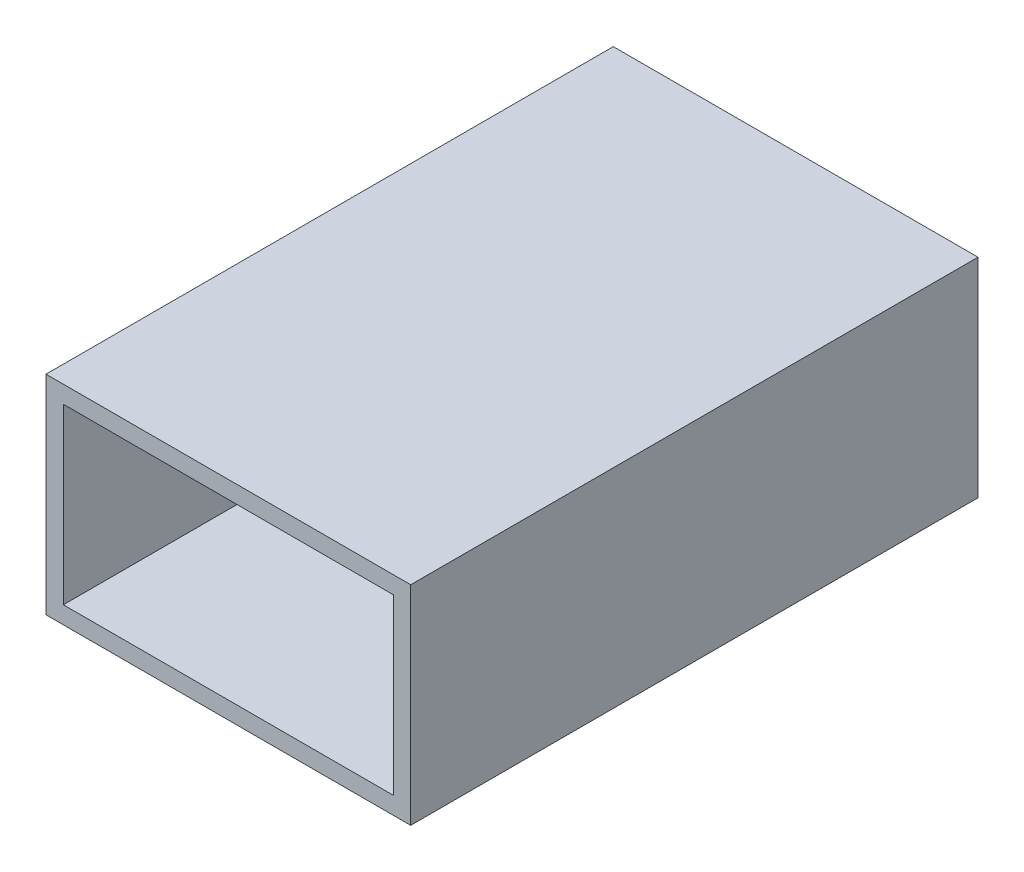
ISO-10303-21;
HEADER;
FILE_DESCRIPTION(('STEP AP214'),'2;1');
FILE_NAME('part.step','',(''),(''),'','','');
FILE_SCHEMA(('AUTOMOTIVE_DESIGN { 1 0 10303 214 1 1 1 1 }'));
ENDSEC;
DATA;
#1=APPLICATION_CONTEXT('core data for automotive mechanical design processes');
#2=APPLICATION_PROTOCOL_DEFINITION('international standard','automotive_design',2000,#1);
#3=PRODUCT_CONTEXT('',#1,'mechanical');
#4=PRODUCT('Part','Part','',(#3));
#5=PRODUCT_RELATED_PRODUCT_CATEGORY('part','',(#4));
#6=PRODUCT_DEFINITION_FORMATION('','',#4);
#7=PRODUCT_DEFINITION_CONTEXT('part definition',#1,'design');
#8=PRODUCT_DEFINITION('design','',#6,#7);
#9=PRODUCT_DEFINITION_SHAPE('','',#8);
#10=(LENGTH_UNIT() NAMED_UNIT(*) SI_UNIT(.MILLI.,.METRE.));
#11=(NAMED_UNIT(*) PLANE_ANGLE_UNIT() SI_UNIT($,.RADIAN.));
#12=(NAMED_UNIT(*) SI_UNIT($,.STERADIAN.) SOLID_ANGLE_UNIT());
#13=UNCERTAINTY_MEASURE_WITH_UNIT(LENGTH_MEASURE(1.E-05),#10,'distance_accuracy_value','');
#14=(GEOMETRIC_REPRESENTATION_CONTEXT(3) GLOBAL_UNCERTAINTY_ASSIGNED_CONTEXT((#13)) GLOBAL_UNIT_ASSIGNED_CONTEXT((#10,
#11,#12)) REPRESENTATION_CONTEXT('',''));
#15=CARTESIAN_POINT('',(0.,0.,0.));
#16=DIRECTION('',(0.,0.,1.));
#17=DIRECTION('',(1.,0.,0.));
#18=AXIS2_PLACEMENT_3D('',#15,#16,#17);
#19=CARTESIAN_POINT('',(0.,0.,98.));
#20=DIRECTION('',(0.,0.,-1.));
#21=DIRECTION('',(-1.,0.,0.));
#22=AXIS2_PLACEMENT_3D('',#19,#20,#21);
#23=PLANE('',#22);
#24=DIRECTION('',(0.,-1.,0.));
#25=VECTOR('',#24,1.);
#26=CARTESIAN_POINT('',(-31.5,-18.,98.));
#27=LINE('',#26,#25);
#28=CARTESIAN_POINT('',(-31.5,18.,98.));
#29=VERTEX_POINT('',#28);
#30=CARTESIAN_POINT('',(-31.5,-18.,98.));
#31=VERTEX_POINT('',#30);
#32=EDGE_CURVE('E137',#29,#31,#27,.T.);
#33=ORIENTED_EDGE('',*,*,#32,.T.);
#34=DIRECTION('',(1.,0.,0.));
#35=VECTOR('',#34,1.);
#36=CARTESIAN_POINT('',(-31.5,-18.,98.));
#37=LINE('',#36,#35);
#38=CARTESIAN_POINT('',(31.5,-18.,98.));
#39=VERTEX_POINT('',#38);
#40=EDGE_CURVE('E140',#31,#39,#37,.T.);
#41=ORIENTED_EDGE('',*,*,#40,.T.);
#42=DIRECTION('',(0.,1.,0.));
#43=VECTOR('',#42,1.);
#44=CARTESIAN_POINT('',(31.5,-18.,98.));
#45=LINE('',#44,#43);
#46=CARTESIAN_POINT('',(31.5,18.,98.));
#47=VERTEX_POINT('',#46);
#48=EDGE_CURVE('E143',#39,#47,#45,.T.);
#49=ORIENTED_EDGE('',*,*,#48,.T.);
#50=DIRECTION('',(-1.,0.,0.));
#51=VECTOR('',#50,1.);
#52=CARTESIAN_POINT('',(-31.5,18.,98.));
#53=LINE('',#52,#51);
#54=EDGE_CURVE('E145',#47,#29,#53,.T.);
#55=ORIENTED_EDGE('',*,*,#54,.T.);
#56=EDGE_LOOP('',(#33,#41,#49,#55));
#57=FACE_BOUND('',#56,.T.);
#58=DIRECTION('',(0.,1.,0.));
#59=VECTOR('',#58,1.);
#60=CARTESIAN_POINT('',(28.5,-15.,98.));
#61=LINE('',#60,#59);
#62=CARTESIAN_POINT('',(28.5,-15.,98.));
#63=VERTEX_POINT('',#62);
#64=CARTESIAN_POINT('',(28.5,15.,98.));
#65=VERTEX_POINT('',#64);
#66=EDGE_CURVE('E124',#63,#65,#61,.T.);
#67=ORIENTED_EDGE('',*,*,#66,.F.);
#68=DIRECTION('',(1.,0.,0.));
#69=VECTOR('',#68,1.);
#70=CARTESIAN_POINT('',(-28.5,-15.,98.));
#71=LINE('',#70,#69);
#72=CARTESIAN_POINT('',(-28.5,-15.,98.));
#73=VERTEX_POINT('',#72);
#74=EDGE_CURVE('E108',#73,#63,#71,.T.);
#75=ORIENTED_EDGE('',*,*,#74,.F.);
#76=DIRECTION('',(0.,-1.,0.));
#77=VECTOR('',#76,1.);
#78=CARTESIAN_POINT('',(-28.5,-15.,98.));
#79=LINE('',#78,#77);
#80=CARTESIAN_POINT('',(-28.5,15.,98.));
#81=VERTEX_POINT('',#80);
#82=EDGE_CURVE('E128',#81,#73,#79,.T.);
#83=ORIENTED_EDGE('',*,*,#82,.F.);
#84=DIRECTION('',(-1.,0.,0.));
#85=VECTOR('',#84,1.);
#86=CARTESIAN_POINT('',(-28.5,15.,98.));
#87=LINE('',#86,#85);
#88=EDGE_CURVE('E126',#65,#81,#87,.T.);
#89=ORIENTED_EDGE('',*,*,#88,.F.);
#90=EDGE_LOOP('',(#67,#75,#83,#89));
#91=FACE_BOUND('',#90,.T.);
#92=ADVANCED_FACE('F35',(#57,#91),#23,.F.);
#93=CARTESIAN_POINT('',(0.,0.,0.));
#94=DIRECTION('',(0.,0.,-1.));
#95=DIRECTION('',(-1.,0.,0.));
#96=AXIS2_PLACEMENT_3D('',#93,#94,#95);
#97=PLANE('',#96);
#98=DIRECTION('',(0.,-1.,0.));
#99=VECTOR('',#98,1.);
#100=CARTESIAN_POINT('',(-31.5,-18.,0.));
#101=LINE('',#100,#99);
#102=CARTESIAN_POINT('',(-31.5,18.,0.));
#103=VERTEX_POINT('',#102);
#104=CARTESIAN_POINT('',(-31.5,-18.,0.));
#105=VERTEX_POINT('',#104);
#106=EDGE_CURVE('E136',#103,#105,#101,.T.);
#107=ORIENTED_EDGE('',*,*,#106,.F.);
#108=DIRECTION('',(-1.,0.,0.));
#109=VECTOR('',#108,1.);
#110=CARTESIAN_POINT('',(-31.5,18.,0.));
#111=LINE('',#110,#109);
#112=CARTESIAN_POINT('',(31.5,18.,0.));
#113=VERTEX_POINT('',#112);
#114=EDGE_CURVE('E141',#113,#103,#111,.T.);
#115=ORIENTED_EDGE('',*,*,#114,.F.);
#116=DIRECTION('',(0.,1.,0.));
#117=VECTOR('',#116,1.);
#118=CARTESIAN_POINT('',(31.5,-18.,0.));
#119=LINE('',#118,#117);
#120=CARTESIAN_POINT('',(31.5,-18.,0.));
#121=VERTEX_POINT('',#120);
#122=EDGE_CURVE('E152',#121,#113,#119,.T.);
#123=ORIENTED_EDGE('',*,*,#122,.F.);
#124=DIRECTION('',(1.,0.,0.));
#125=VECTOR('',#124,1.);
#126=CARTESIAN_POINT('',(-31.5,-18.,0.));
#127=LINE('',#126,#125);
#128=EDGE_CURVE('E150',#105,#121,#127,.T.);
#129=ORIENTED_EDGE('',*,*,#128,.F.);
#130=EDGE_LOOP('',(#107,#115,#123,#129));
#131=FACE_BOUND('',#130,.T.);
#132=ADVANCED_FACE('F170',(#131),#97,.T.);
#133=CARTESIAN_POINT('',(-31.5,-18.,98.));
#134=DIRECTION('',(1.,0.,0.));
#135=DIRECTION('',(0.,0.,-1.));
#136=AXIS2_PLACEMENT_3D('',#133,#134,#135);
#137=PLANE('',#136);
#138=ORIENTED_EDGE('',*,*,#106,.T.);
#139=DIRECTION('',(0.,0.,-1.));
#140=VECTOR('',#139,1.);
#141=CARTESIAN_POINT('',(-31.5,-18.,98.));
#142=LINE('',#141,#140);
#143=EDGE_CURVE('E11',#31,#105,#142,.T.);
#144=ORIENTED_EDGE('',*,*,#143,.F.);
#145=ORIENTED_EDGE('',*,*,#32,.F.);
#146=DIRECTION('',(0.,0.,-1.));
#147=VECTOR('',#146,1.);
#148=CARTESIAN_POINT('',(-31.5,18.,98.));
#149=LINE('',#148,#147);
#150=EDGE_CURVE('E147',#29,#103,#149,.T.);
#151=ORIENTED_EDGE('',*,*,#150,.T.);
#152=EDGE_LOOP('',(#138,#144,#145,#151));
#153=FACE_BOUND('',#152,.T.);
#154=ADVANCED_FACE('F37',(#153),#137,.F.);
#155=CARTESIAN_POINT('',(-31.5,-18.,98.));
#156=DIRECTION('',(0.,1.,0.));
#157=DIRECTION('',(0.,0.,1.));
#158=AXIS2_PLACEMENT_3D('',#155,#156,#157);
#159=PLANE('',#158);
#160=ORIENTED_EDGE('',*,*,#128,.T.);
#161=DIRECTION('',(0.,0.,-1.));
#162=VECTOR('',#161,1.);
#163=CARTESIAN_POINT('',(31.5,-18.,98.));
#164=LINE('',#163,#162);
#165=EDGE_CURVE('E43',#39,#121,#164,.T.);
#166=ORIENTED_EDGE('',*,*,#165,.F.);
#167=ORIENTED_EDGE('',*,*,#40,.F.);
#168=ORIENTED_EDGE('',*,*,#143,.T.);
#169=EDGE_LOOP('',(#160,#166,#167,#168));
#170=FACE_BOUND('',#169,.T.);
#171=ADVANCED_FACE('F180',(#170),#159,.F.);
#172=CARTESIAN_POINT('',(31.5,-18.,98.));
#173=DIRECTION('',(-1.,0.,0.));
#174=DIRECTION('',(0.,-1.,0.));
#175=AXIS2_PLACEMENT_3D('',#172,#173,#174);
#176=PLANE('',#175);
#177=ORIENTED_EDGE('',*,*,#122,.T.);
#178=DIRECTION('',(0.,0.,-1.));
#179=VECTOR('',#178,1.);
#180=CARTESIAN_POINT('',(31.5,18.,98.));
#181=LINE('',#180,#179);
#182=EDGE_CURVE('E157',#47,#113,#181,.T.);
#183=ORIENTED_EDGE('',*,*,#182,.F.);
#184=ORIENTED_EDGE('',*,*,#48,.F.);
#185=ORIENTED_EDGE('',*,*,#165,.T.);
#186=EDGE_LOOP('',(#177,#183,#184,#185));
#187=FACE_BOUND('',#186,.T.);
#188=ADVANCED_FACE('F164',(#187),#176,.F.);
#189=CARTESIAN_POINT('',(-31.5,18.,98.));
#190=DIRECTION('',(0.,-1.,0.));
#191=DIRECTION('',(0.,0.,-1.));
#192=AXIS2_PLACEMENT_3D('',#189,#190,#191);
#193=PLANE('',#192);
#194=ORIENTED_EDGE('',*,*,#114,.T.);
#195=ORIENTED_EDGE('',*,*,#150,.F.);
#196=ORIENTED_EDGE('',*,*,#54,.F.);
#197=ORIENTED_EDGE('',*,*,#182,.T.);
#198=EDGE_LOOP('',(#194,#195,#196,#197));
#199=FACE_BOUND('',#198,.T.);
#200=ADVANCED_FACE('F173',(#199),#193,.F.);
#201=CARTESIAN_POINT('',(28.5,-15.,98.));
#202=DIRECTION('',(-1.,0.,0.));
#203=DIRECTION('',(0.,0.,1.));
#204=AXIS2_PLACEMENT_3D('',#201,#202,#203);
#205=PLANE('',#204);
#206=DIRECTION('',(0.,-1.,0.));
#207=VECTOR('',#206,1.);
#208=CARTESIAN_POINT('',(28.5,-15.,3.));
#209=LINE('',#208,#207);
#210=CARTESIAN_POINT('',(28.5,15.,3.));
#211=VERTEX_POINT('',#210);
#212=CARTESIAN_POINT('',(28.5,-15.,3.));
#213=VERTEX_POINT('',#212);
#214=EDGE_CURVE('E114',#211,#213,#209,.T.);
#215=ORIENTED_EDGE('',*,*,#214,.T.);
#216=DIRECTION('',(0.,0.,-1.));
#217=VECTOR('',#216,1.);
#218=CARTESIAN_POINT('',(28.5,-15.,98.));
#219=LINE('',#218,#217);
#220=EDGE_CURVE('E102',#63,#213,#219,.T.);
#221=ORIENTED_EDGE('',*,*,#220,.F.);
#222=ORIENTED_EDGE('',*,*,#66,.T.);
#223=DIRECTION('',(0.,0.,-1.));
#224=VECTOR('',#223,1.);
#225=CARTESIAN_POINT('',(28.5,15.,98.));
#226=LINE('',#225,#224);
#227=EDGE_CURVE('E116',#65,#211,#226,.T.);
#228=ORIENTED_EDGE('',*,*,#227,.T.);
#229=EDGE_LOOP('',(#215,#221,#222,#228));
#230=FACE_BOUND('',#229,.T.);
#231=ADVANCED_FACE('F115',(#230),#205,.T.);
#232=CARTESIAN_POINT('',(-28.5,15.,98.));
#233=DIRECTION('',(0.,-1.,0.));
#234=DIRECTION('',(0.,0.,-1.));
#235=AXIS2_PLACEMENT_3D('',#232,#233,#234);
#236=PLANE('',#235);
#237=DIRECTION('',(1.,0.,0.));
#238=VECTOR('',#237,1.);
#239=CARTESIAN_POINT('',(28.5,15.,3.));
#240=LINE('',#239,#238);
#241=CARTESIAN_POINT('',(-28.5,15.,3.));
#242=VERTEX_POINT('',#241);
#243=EDGE_CURVE('E50',#242,#211,#240,.T.);
#244=ORIENTED_EDGE('',*,*,#243,.T.);
#245=ORIENTED_EDGE('',*,*,#227,.F.);
#246=ORIENTED_EDGE('',*,*,#88,.T.);
#247=DIRECTION('',(0.,0.,-1.));
#248=VECTOR('',#247,1.);
#249=CARTESIAN_POINT('',(-28.5,15.,98.));
#250=LINE('',#249,#248);
#251=EDGE_CURVE('E133',#81,#242,#250,.T.);
#252=ORIENTED_EDGE('',*,*,#251,.T.);
#253=EDGE_LOOP('',(#244,#245,#246,#252));
#254=FACE_BOUND('',#253,.T.);
#255=ADVANCED_FACE('F200',(#254),#236,.T.);
#256=CARTESIAN_POINT('',(-28.5,-15.,98.));
#257=DIRECTION('',(1.,0.,0.));
#258=DIRECTION('',(0.,0.,-1.));
#259=AXIS2_PLACEMENT_3D('',#256,#257,#258);
#260=PLANE('',#259);
#261=DIRECTION('',(0.,1.,0.));
#262=VECTOR('',#261,1.);
#263=CARTESIAN_POINT('',(-28.5,-15.,3.));
#264=LINE('',#263,#262);
#265=CARTESIAN_POINT('',(-28.5,-15.,3.));
#266=VERTEX_POINT('',#265);
#267=EDGE_CURVE('E58',#266,#242,#264,.T.);
#268=ORIENTED_EDGE('',*,*,#267,.T.);
#269=ORIENTED_EDGE('',*,*,#251,.F.);
#270=ORIENTED_EDGE('',*,*,#82,.T.);
#271=DIRECTION('',(0.,0.,-1.));
#272=VECTOR('',#271,1.);
#273=CARTESIAN_POINT('',(-28.5,-15.,98.));
#274=LINE('',#273,#272);
#275=EDGE_CURVE('E111',#73,#266,#274,.T.);
#276=ORIENTED_EDGE('',*,*,#275,.T.);
#277=EDGE_LOOP('',(#268,#269,#270,#276));
#278=FACE_BOUND('',#277,.T.);
#279=ADVANCED_FACE('F204',(#278),#260,.T.);
#280=CARTESIAN_POINT('',(-28.5,-15.,98.));
#281=DIRECTION('',(0.,1.,0.));
#282=DIRECTION('',(0.,0.,1.));
#283=AXIS2_PLACEMENT_3D('',#280,#281,#282);
#284=PLANE('',#283);
#285=DIRECTION('',(-1.,0.,0.));
#286=VECTOR('',#285,1.);
#287=CARTESIAN_POINT('',(28.5,-15.,3.));
#288=LINE('',#287,#286);
#289=EDGE_CURVE('E106',#213,#266,#288,.T.);
#290=ORIENTED_EDGE('',*,*,#289,.T.);
#291=ORIENTED_EDGE('',*,*,#275,.F.);
#292=ORIENTED_EDGE('',*,*,#74,.T.);
#293=ORIENTED_EDGE('',*,*,#220,.T.);
#294=EDGE_LOOP('',(#290,#291,#292,#293));
#295=FACE_BOUND('',#294,.T.);
#296=ADVANCED_FACE('F104',(#295),#284,.T.);
#297=CARTESIAN_POINT('',(0.,0.,3.));
#298=DIRECTION('',(0.,0.,1.));
#299=DIRECTION('',(1.,0.,0.));
#300=AXIS2_PLACEMENT_3D('',#297,#298,#299);
#301=PLANE('',#300);
#302=ORIENTED_EDGE('',*,*,#214,.F.);
#303=ORIENTED_EDGE('',*,*,#243,.F.);
#304=ORIENTED_EDGE('',*,*,#267,.F.);
#305=ORIENTED_EDGE('',*,*,#289,.F.);
#306=EDGE_LOOP('',(#302,#303,#304,#305));
#307=FACE_BOUND('',#306,.T.);
#308=ADVANCED_FACE('F119',(#307),#301,.T.);
#309=CLOSED_SHELL('',(#92,#132,#154,#171,#188,#200,#231,#255,#279,#296,#308));
#310=MANIFOLD_SOLID_BREP('B2',#309);
#311=ADVANCED_BREP_SHAPE_REPRESENTATION('',(#18,#310),#14);
#312=SHAPE_DEFINITION_REPRESENTATION(#9,#311);
ENDSEC;
END-ISO-10303-21;
